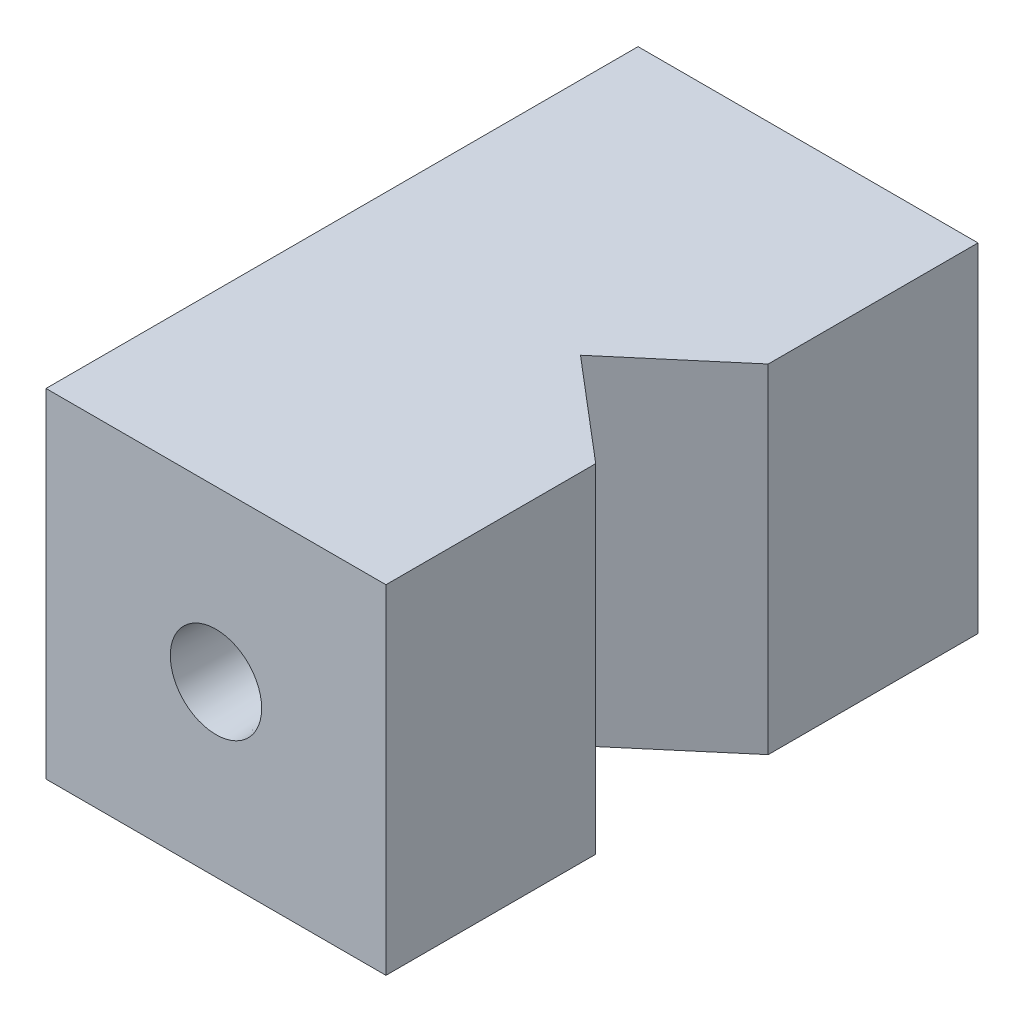
ISO-10303-21;
HEADER;
FILE_DESCRIPTION(('STEP AP214'),'2;1');
FILE_NAME('part.step','',(''),(''),'','','');
FILE_SCHEMA(('AUTOMOTIVE_DESIGN { 1 0 10303 214 1 1 1 1 }'));
ENDSEC;
DATA;
#1=APPLICATION_CONTEXT('core data for automotive mechanical design processes');
#2=APPLICATION_PROTOCOL_DEFINITION('international standard','automotive_design',2000,#1);
#3=PRODUCT_CONTEXT('',#1,'mechanical');
#4=PRODUCT('Part','Part','',(#3));
#5=PRODUCT_RELATED_PRODUCT_CATEGORY('part','',(#4));
#6=PRODUCT_DEFINITION_FORMATION('','',#4);
#7=PRODUCT_DEFINITION_CONTEXT('part definition',#1,'design');
#8=PRODUCT_DEFINITION('design','',#6,#7);
#9=PRODUCT_DEFINITION_SHAPE('','',#8);
#10=(LENGTH_UNIT() NAMED_UNIT(*) SI_UNIT(.MILLI.,.METRE.));
#11=(NAMED_UNIT(*) PLANE_ANGLE_UNIT() SI_UNIT($,.RADIAN.));
#12=(NAMED_UNIT(*) SI_UNIT($,.STERADIAN.) SOLID_ANGLE_UNIT());
#13=UNCERTAINTY_MEASURE_WITH_UNIT(LENGTH_MEASURE(1.E-05),#10,'distance_accuracy_value','');
#14=(GEOMETRIC_REPRESENTATION_CONTEXT(3) GLOBAL_UNCERTAINTY_ASSIGNED_CONTEXT((#13)) GLOBAL_UNIT_ASSIGNED_CONTEXT((#10,
#11,#12)) REPRESENTATION_CONTEXT('',''));
#15=CARTESIAN_POINT('',(0.,0.,0.));
#16=DIRECTION('',(0.,0.,1.));
#17=DIRECTION('',(1.,0.,0.));
#18=AXIS2_PLACEMENT_3D('',#15,#16,#17);
#19=CARTESIAN_POINT('',(0.,20.2,0.));
#20=DIRECTION('',(0.,1.,0.));
#21=DIRECTION('',(0.,0.,1.));
#22=AXIS2_PLACEMENT_3D('',#19,#20,#21);
#23=PLANE('',#22);
#24=DIRECTION('',(0.,0.,-1.));
#25=VECTOR('',#24,1.);
#26=CARTESIAN_POINT('',(-22.0969858620224,20.2,-17.5));
#27=LINE('',#26,#25);
#28=CARTESIAN_POINT('',(-22.0969858620224,20.2,17.5));
#29=VERTEX_POINT('',#28);
#30=CARTESIAN_POINT('',(-22.0969858620224,20.2,-17.5));
#31=VERTEX_POINT('',#30);
#32=EDGE_CURVE('E113',#29,#31,#27,.T.);
#33=ORIENTED_EDGE('',*,*,#32,.F.);
#34=DIRECTION('',(1.,0.,0.));
#35=VECTOR('',#34,1.);
#36=CARTESIAN_POINT('',(-2.,20.2,17.5));
#37=LINE('',#36,#35);
#38=CARTESIAN_POINT('',(-2.,20.2,17.5));
#39=VERTEX_POINT('',#38);
#40=EDGE_CURVE('E134',#29,#39,#37,.T.);
#41=ORIENTED_EDGE('',*,*,#40,.T.);
#42=DIRECTION('',(0.,0.,1.));
#43=VECTOR('',#42,1.);
#44=CARTESIAN_POINT('',(-2.,20.2,0.));
#45=LINE('',#44,#43);
#46=CARTESIAN_POINT('',(-2.,20.2,5.1));
#47=VERTEX_POINT('',#46);
#48=EDGE_CURVE('E149',#47,#39,#45,.T.);
#49=ORIENTED_EDGE('',*,*,#48,.F.);
#50=DIRECTION('',(0.761939317759459,0.,0.64764842009554));
#51=VECTOR('',#50,1.);
#52=CARTESIAN_POINT('',(-3.355587808418,20.2,3.9477503628447));
#53=LINE('',#52,#51);
#54=CARTESIAN_POINT('',(-8.,20.2,0.));
#55=VERTEX_POINT('',#54);
#56=EDGE_CURVE('E167',#55,#47,#53,.T.);
#57=ORIENTED_EDGE('',*,*,#56,.F.);
#58=DIRECTION('',(-0.761939317759459,0.,0.64764842009554));
#59=VECTOR('',#58,1.);
#60=CARTESIAN_POINT('',(-3.355587808418,20.2,-3.9477503628447));
#61=LINE('',#60,#59);
#62=CARTESIAN_POINT('',(-2.,20.2,-5.1));
#63=VERTEX_POINT('',#62);
#64=EDGE_CURVE('E163',#63,#55,#61,.T.);
#65=ORIENTED_EDGE('',*,*,#64,.F.);
#66=DIRECTION('',(0.,0.,-1.));
#67=VECTOR('',#66,1.);
#68=CARTESIAN_POINT('',(-2.,20.2,0.));
#69=LINE('',#68,#67);
#70=CARTESIAN_POINT('',(-2.,20.2,-17.5));
#71=VERTEX_POINT('',#70);
#72=EDGE_CURVE('E138',#63,#71,#69,.T.);
#73=ORIENTED_EDGE('',*,*,#72,.T.);
#74=DIRECTION('',(-1.,0.,0.));
#75=VECTOR('',#74,1.);
#76=CARTESIAN_POINT('',(-24.3669858620224,20.2,-17.5));
#77=LINE('',#76,#75);
#78=EDGE_CURVE('E118',#71,#31,#77,.T.);
#79=ORIENTED_EDGE('',*,*,#78,.T.);
#80=EDGE_LOOP('',(#33,#41,#49,#57,#65,#73,#79));
#81=FACE_BOUND('',#80,.T.);
#82=ADVANCED_FACE('F44',(#81),#23,.T.);
#83=CARTESIAN_POINT('',(0.,0.2,0.));
#84=DIRECTION('',(0.,1.,0.));
#85=DIRECTION('',(0.,0.,1.));
#86=AXIS2_PLACEMENT_3D('',#83,#84,#85);
#87=PLANE('',#86);
#88=DIRECTION('',(1.,0.,0.));
#89=VECTOR('',#88,1.);
#90=CARTESIAN_POINT('',(-2.,0.199999999999999,17.5));
#91=LINE('',#90,#89);
#92=CARTESIAN_POINT('',(-22.0969858620224,0.199999999999999,17.5));
#93=VERTEX_POINT('',#92);
#94=CARTESIAN_POINT('',(-2.,0.199999999999999,17.5));
#95=VERTEX_POINT('',#94);
#96=EDGE_CURVE('E127',#93,#95,#91,.T.);
#97=ORIENTED_EDGE('',*,*,#96,.F.);
#98=DIRECTION('',(0.,0.,-1.));
#99=VECTOR('',#98,1.);
#100=CARTESIAN_POINT('',(-22.0969858620224,0.199999999999999,-17.5));
#101=LINE('',#100,#99);
#102=CARTESIAN_POINT('',(-22.0969858620224,0.199999999999999,-17.5));
#103=VERTEX_POINT('',#102);
#104=EDGE_CURVE('E60',#93,#103,#101,.T.);
#105=ORIENTED_EDGE('',*,*,#104,.T.);
#106=DIRECTION('',(-1.,0.,0.));
#107=VECTOR('',#106,1.);
#108=CARTESIAN_POINT('',(-24.3669858620224,0.199999999999999,-17.5));
#109=LINE('',#108,#107);
#110=CARTESIAN_POINT('',(-2.,0.199999999999999,-17.5));
#111=VERTEX_POINT('',#110);
#112=EDGE_CURVE('E125',#111,#103,#109,.T.);
#113=ORIENTED_EDGE('',*,*,#112,.F.);
#114=DIRECTION('',(0.,0.,-1.));
#115=VECTOR('',#114,1.);
#116=CARTESIAN_POINT('',(-2.,0.199999999999999,0.));
#117=LINE('',#116,#115);
#118=CARTESIAN_POINT('',(-2.,0.199999999999999,-5.1));
#119=VERTEX_POINT('',#118);
#120=EDGE_CURVE('E145',#119,#111,#117,.T.);
#121=ORIENTED_EDGE('',*,*,#120,.F.);
#122=DIRECTION('',(-0.761939317759459,0.,0.64764842009554));
#123=VECTOR('',#122,1.);
#124=CARTESIAN_POINT('',(-3.355587808418,0.199999999999999,-3.9477503628447));
#125=LINE('',#124,#123);
#126=CARTESIAN_POINT('',(-8.,0.199999999999999,0.));
#127=VERTEX_POINT('',#126);
#128=EDGE_CURVE('E148',#119,#127,#125,.T.);
#129=ORIENTED_EDGE('',*,*,#128,.T.);
#130=DIRECTION('',(0.761939317759459,0.,0.64764842009554));
#131=VECTOR('',#130,1.);
#132=CARTESIAN_POINT('',(-3.355587808418,0.199999999999999,3.9477503628447));
#133=LINE('',#132,#131);
#134=CARTESIAN_POINT('',(-2.,0.199999999999999,5.1));
#135=VERTEX_POINT('',#134);
#136=EDGE_CURVE('E153',#127,#135,#133,.T.);
#137=ORIENTED_EDGE('',*,*,#136,.T.);
#138=DIRECTION('',(0.,0.,1.));
#139=VECTOR('',#138,1.);
#140=CARTESIAN_POINT('',(-2.,0.199999999999999,0.));
#141=LINE('',#140,#139);
#142=EDGE_CURVE('E157',#135,#95,#141,.T.);
#143=ORIENTED_EDGE('',*,*,#142,.T.);
#144=EDGE_LOOP('',(#97,#105,#113,#121,#129,#137,#143));
#145=FACE_BOUND('',#144,.T.);
#146=ADVANCED_FACE('F123',(#145),#87,.F.);
#147=CARTESIAN_POINT('',(-2.,0.199999999999999,0.));
#148=DIRECTION('',(-1.,0.,0.));
#149=DIRECTION('',(0.,0.,1.));
#150=AXIS2_PLACEMENT_3D('',#147,#148,#149);
#151=PLANE('',#150);
#152=ORIENTED_EDGE('',*,*,#48,.T.);
#153=DIRECTION('',(0.,1.,0.));
#154=VECTOR('',#153,1.);
#155=CARTESIAN_POINT('',(-2.,0.199999999999999,17.5));
#156=LINE('',#155,#154);
#157=EDGE_CURVE('E54',#95,#39,#156,.T.);
#158=ORIENTED_EDGE('',*,*,#157,.F.);
#159=ORIENTED_EDGE('',*,*,#142,.F.);
#160=DIRECTION('',(0.,1.,0.));
#161=VECTOR('',#160,1.);
#162=CARTESIAN_POINT('',(-2.,0.199999999999999,5.1));
#163=LINE('',#162,#161);
#164=EDGE_CURVE('E69',#135,#47,#163,.T.);
#165=ORIENTED_EDGE('',*,*,#164,.T.);
#166=EDGE_LOOP('',(#152,#158,#159,#165));
#167=FACE_BOUND('',#166,.T.);
#168=ADVANCED_FACE('F192',(#167),#151,.F.);
#169=CARTESIAN_POINT('',(-3.355587808418,0.199999999999999,3.9477503628447));
#170=DIRECTION('',(-0.64764842009554,0.,0.761939317759459));
#171=DIRECTION('',(0.761939317759459,0.,0.64764842009554));
#172=AXIS2_PLACEMENT_3D('',#169,#170,#171);
#173=PLANE('',#172);
#174=ORIENTED_EDGE('',*,*,#56,.T.);
#175=ORIENTED_EDGE('',*,*,#164,.F.);
#176=ORIENTED_EDGE('',*,*,#136,.F.);
#177=DIRECTION('',(0.,1.,0.));
#178=VECTOR('',#177,1.);
#179=CARTESIAN_POINT('',(-8.,0.199999999999999,0.));
#180=LINE('',#179,#178);
#181=EDGE_CURVE('E177',#127,#55,#180,.T.);
#182=ORIENTED_EDGE('',*,*,#181,.T.);
#183=EDGE_LOOP('',(#174,#175,#176,#182));
#184=FACE_BOUND('',#183,.T.);
#185=ADVANCED_FACE('F189',(#184),#173,.F.);
#186=CARTESIAN_POINT('',(-3.355587808418,0.199999999999999,-3.9477503628447));
#187=DIRECTION('',(-0.64764842009554,0.,-0.761939317759459));
#188=DIRECTION('',(-0.761939317759459,0.,0.64764842009554));
#189=AXIS2_PLACEMENT_3D('',#186,#187,#188);
#190=PLANE('',#189);
#191=ORIENTED_EDGE('',*,*,#64,.T.);
#192=ORIENTED_EDGE('',*,*,#181,.F.);
#193=ORIENTED_EDGE('',*,*,#128,.F.);
#194=DIRECTION('',(0.,1.,0.));
#195=VECTOR('',#194,1.);
#196=CARTESIAN_POINT('',(-2.,0.199999999999999,-5.1));
#197=LINE('',#196,#195);
#198=EDGE_CURVE('E92',#119,#63,#197,.T.);
#199=ORIENTED_EDGE('',*,*,#198,.T.);
#200=EDGE_LOOP('',(#191,#192,#193,#199));
#201=FACE_BOUND('',#200,.T.);
#202=ADVANCED_FACE('F188',(#201),#190,.F.);
#203=CARTESIAN_POINT('',(-2.,0.199999999999999,0.));
#204=DIRECTION('',(1.,0.,0.));
#205=DIRECTION('',(0.,0.,-1.));
#206=AXIS2_PLACEMENT_3D('',#203,#204,#205);
#207=PLANE('',#206);
#208=ORIENTED_EDGE('',*,*,#72,.F.);
#209=ORIENTED_EDGE('',*,*,#198,.F.);
#210=ORIENTED_EDGE('',*,*,#120,.T.);
#211=DIRECTION('',(0.,1.,0.));
#212=VECTOR('',#211,1.);
#213=CARTESIAN_POINT('',(-2.,0.199999999999999,-17.5));
#214=LINE('',#213,#212);
#215=EDGE_CURVE('E132',#111,#71,#214,.T.);
#216=ORIENTED_EDGE('',*,*,#215,.T.);
#217=EDGE_LOOP('',(#208,#209,#210,#216));
#218=FACE_BOUND('',#217,.T.);
#219=ADVANCED_FACE('F182',(#218),#207,.T.);
#220=CARTESIAN_POINT('',(-24.3669858620224,0.199999999999999,-17.5));
#221=DIRECTION('',(0.,0.,-1.));
#222=DIRECTION('',(-1.,0.,0.));
#223=AXIS2_PLACEMENT_3D('',#220,#221,#222);
#224=PLANE('',#223);
#225=CARTESIAN_POINT('',(-12.0484929310112,10.2,-17.5));
#226=DIRECTION('',(0.,0.,-1.));
#227=DIRECTION('',(-1.,0.,0.));
#228=AXIS2_PLACEMENT_3D('',#225,#226,#227);
#229=CIRCLE('',#228,2.70000000000001);
#230=CARTESIAN_POINT('',(-14.7484929310112,10.2,-17.5));
#231=VERTEX_POINT('',#230);
#232=EDGE_CURVE('E217',#231,#231,#229,.T.);
#233=ORIENTED_EDGE('',*,*,#232,.F.);
#234=EDGE_LOOP('',(#233));
#235=FACE_BOUND('',#234,.T.);
#236=DIRECTION('',(0.,1.,0.));
#237=VECTOR('',#236,1.);
#238=CARTESIAN_POINT('',(-22.0969858620224,0.199999999999999,-17.5));
#239=LINE('',#238,#237);
#240=EDGE_CURVE('E110',#103,#31,#239,.T.);
#241=ORIENTED_EDGE('',*,*,#240,.T.);
#242=ORIENTED_EDGE('',*,*,#78,.F.);
#243=ORIENTED_EDGE('',*,*,#215,.F.);
#244=ORIENTED_EDGE('',*,*,#112,.T.);
#245=EDGE_LOOP('',(#241,#242,#243,#244));
#246=FACE_BOUND('',#245,.T.);
#247=ADVANCED_FACE('F130',(#235,#246),#224,.T.);
#248=CARTESIAN_POINT('',(-2.,0.199999999999999,17.5));
#249=DIRECTION('',(0.,0.,1.));
#250=DIRECTION('',(1.,0.,0.));
#251=AXIS2_PLACEMENT_3D('',#248,#249,#250);
#252=PLANE('',#251);
#253=CARTESIAN_POINT('',(-12.0484929310112,10.2,17.5));
#254=DIRECTION('',(0.,0.,1.));
#255=DIRECTION('',(1.,0.,0.));
#256=AXIS2_PLACEMENT_3D('',#253,#254,#255);
#257=CIRCLE('',#256,2.70000000000001);
#258=CARTESIAN_POINT('',(-9.34849293101118,10.2,17.5));
#259=VERTEX_POINT('',#258);
#260=EDGE_CURVE('E205',#259,#259,#257,.T.);
#261=ORIENTED_EDGE('',*,*,#260,.F.);
#262=EDGE_LOOP('',(#261));
#263=FACE_BOUND('',#262,.T.);
#264=DIRECTION('',(0.,1.,0.));
#265=VECTOR('',#264,1.);
#266=CARTESIAN_POINT('',(-22.0969858620224,0.199999999999999,17.5));
#267=LINE('',#266,#265);
#268=EDGE_CURVE('E11',#93,#29,#267,.T.);
#269=ORIENTED_EDGE('',*,*,#268,.F.);
#270=ORIENTED_EDGE('',*,*,#96,.T.);
#271=ORIENTED_EDGE('',*,*,#157,.T.);
#272=ORIENTED_EDGE('',*,*,#40,.F.);
#273=EDGE_LOOP('',(#269,#270,#271,#272));
#274=FACE_BOUND('',#273,.T.);
#275=ADVANCED_FACE('F194',(#263,#274),#252,.T.);
#276=CARTESIAN_POINT('',(-22.0969858620224,0.199999999999999,-17.5));
#277=DIRECTION('',(1.,0.,0.));
#278=DIRECTION('',(0.,0.,-1.));
#279=AXIS2_PLACEMENT_3D('',#276,#277,#278);
#280=PLANE('',#279);
#281=ORIENTED_EDGE('',*,*,#268,.T.);
#282=ORIENTED_EDGE('',*,*,#32,.T.);
#283=ORIENTED_EDGE('',*,*,#240,.F.);
#284=ORIENTED_EDGE('',*,*,#104,.F.);
#285=EDGE_LOOP('',(#281,#282,#283,#284));
#286=FACE_BOUND('',#285,.T.);
#287=ADVANCED_FACE('F111',(#286),#280,.F.);
#288=CARTESIAN_POINT('',(-12.0484929310112,10.2,7.5));
#289=DIRECTION('',(0.,0.,-1.));
#290=DIRECTION('',(-1.,0.,0.));
#291=AXIS2_PLACEMENT_3D('',#288,#289,#290);
#292=PLANE('',#291);
#293=CARTESIAN_POINT('',(-12.0484929310112,10.2,7.5));
#294=DIRECTION('',(0.,0.,1.));
#295=DIRECTION('',(1.,0.,0.));
#296=AXIS2_PLACEMENT_3D('',#293,#294,#295);
#297=CIRCLE('',#296,2.40000000000001);
#298=CARTESIAN_POINT('',(-9.64849293101118,10.2,7.5));
#299=VERTEX_POINT('',#298);
#300=EDGE_CURVE('E196',#299,#299,#297,.T.);
#301=ORIENTED_EDGE('',*,*,#300,.T.);
#302=EDGE_LOOP('',(#301));
#303=FACE_BOUND('',#302,.T.);
#304=ADVANCED_FACE('F256',(#303),#292,.F.);
#305=CARTESIAN_POINT('',(-12.0484929310112,10.2,17.5));
#306=DIRECTION('',(0.,0.,1.));
#307=DIRECTION('',(1.,0.,0.));
#308=AXIS2_PLACEMENT_3D('',#305,#306,#307);
#309=CYLINDRICAL_SURFACE('',#308,2.40000000000001);
#310=ORIENTED_EDGE('',*,*,#300,.F.);
#311=EDGE_LOOP('',(#310));
#312=FACE_BOUND('',#311,.T.);
#313=CARTESIAN_POINT('',(-12.0484929310112,10.2,11.5));
#314=DIRECTION('',(0.,0.,1.));
#315=DIRECTION('',(1.,0.,0.));
#316=AXIS2_PLACEMENT_3D('',#313,#314,#315);
#317=CIRCLE('',#316,2.40000000000001);
#318=CARTESIAN_POINT('',(-9.64849293101118,10.2,11.5));
#319=VERTEX_POINT('',#318);
#320=EDGE_CURVE('E199',#319,#319,#317,.T.);
#321=ORIENTED_EDGE('',*,*,#320,.T.);
#322=EDGE_LOOP('',(#321));
#323=FACE_BOUND('',#322,.T.);
#324=ADVANCED_FACE('F247',(#312,#323),#309,.F.);
#325=CARTESIAN_POINT('',(-12.0484929310112,10.2,11.5));
#326=DIRECTION('',(0.,0.,1.));
#327=DIRECTION('',(1.,0.,0.));
#328=AXIS2_PLACEMENT_3D('',#325,#326,#327);
#329=CONICAL_SURFACE('',#328,2.40000000000003,0.0499583957219462);
#330=ORIENTED_EDGE('',*,*,#260,.T.);
#331=EDGE_LOOP('',(#330));
#332=FACE_BOUND('',#331,.T.);
#333=ORIENTED_EDGE('',*,*,#320,.F.);
#334=EDGE_LOOP('',(#333));
#335=FACE_BOUND('',#334,.T.);
#336=ADVANCED_FACE('F242',(#332,#335),#329,.F.);
#337=CARTESIAN_POINT('',(-12.0484929310112,10.2,-7.5));
#338=DIRECTION('',(0.,0.,1.));
#339=DIRECTION('',(1.,0.,0.));
#340=AXIS2_PLACEMENT_3D('',#337,#338,#339);
#341=PLANE('',#340);
#342=CARTESIAN_POINT('',(-12.0484929310112,10.2,-7.5));
#343=DIRECTION('',(0.,0.,-1.));
#344=DIRECTION('',(-1.,0.,0.));
#345=AXIS2_PLACEMENT_3D('',#342,#343,#344);
#346=CIRCLE('',#345,2.40000000000001);
#347=CARTESIAN_POINT('',(-14.4484929310112,10.2,-7.5));
#348=VERTEX_POINT('',#347);
#349=EDGE_CURVE('E209',#348,#348,#346,.T.);
#350=ORIENTED_EDGE('',*,*,#349,.T.);
#351=EDGE_LOOP('',(#350));
#352=FACE_BOUND('',#351,.T.);
#353=ADVANCED_FACE('F246',(#352),#341,.F.);
#354=CARTESIAN_POINT('',(-12.0484929310112,10.2,-17.5));
#355=DIRECTION('',(0.,0.,-1.));
#356=DIRECTION('',(-1.,0.,0.));
#357=AXIS2_PLACEMENT_3D('',#354,#355,#356);
#358=CYLINDRICAL_SURFACE('',#357,2.40000000000001);
#359=ORIENTED_EDGE('',*,*,#349,.F.);
#360=EDGE_LOOP('',(#359));
#361=FACE_BOUND('',#360,.T.);
#362=CARTESIAN_POINT('',(-12.0484929310112,10.2,-11.5));
#363=DIRECTION('',(0.,0.,-1.));
#364=DIRECTION('',(-1.,0.,0.));
#365=AXIS2_PLACEMENT_3D('',#362,#363,#364);
#366=CIRCLE('',#365,2.40000000000001);
#367=CARTESIAN_POINT('',(-14.4484929310112,10.2,-11.5));
#368=VERTEX_POINT('',#367);
#369=EDGE_CURVE('E213',#368,#368,#366,.T.);
#370=ORIENTED_EDGE('',*,*,#369,.T.);
#371=EDGE_LOOP('',(#370));
#372=FACE_BOUND('',#371,.T.);
#373=ADVANCED_FACE('F253',(#361,#372),#358,.F.);
#374=CARTESIAN_POINT('',(-12.0484929310112,10.2,-11.5));
#375=DIRECTION('',(0.,0.,-1.));
#376=DIRECTION('',(-1.,0.,0.));
#377=AXIS2_PLACEMENT_3D('',#374,#375,#376);
#378=CONICAL_SURFACE('',#377,2.40000000000003,0.0499583957219462);
#379=ORIENTED_EDGE('',*,*,#232,.T.);
#380=EDGE_LOOP('',(#379));
#381=FACE_BOUND('',#380,.T.);
#382=ORIENTED_EDGE('',*,*,#369,.F.);
#383=EDGE_LOOP('',(#382));
#384=FACE_BOUND('',#383,.T.);
#385=ADVANCED_FACE('F47',(#381,#384),#378,.F.);
#386=CLOSED_SHELL('',(#82,#146,#168,#185,#202,#219,#247,#275,#287,#304,#324,#336,#353,#373,#385));
#387=MANIFOLD_SOLID_BREP('B2',#386);
#388=ADVANCED_BREP_SHAPE_REPRESENTATION('',(#18,#387),#14);
#389=SHAPE_DEFINITION_REPRESENTATION(#9,#388);
ENDSEC;
END-ISO-10303-21;
